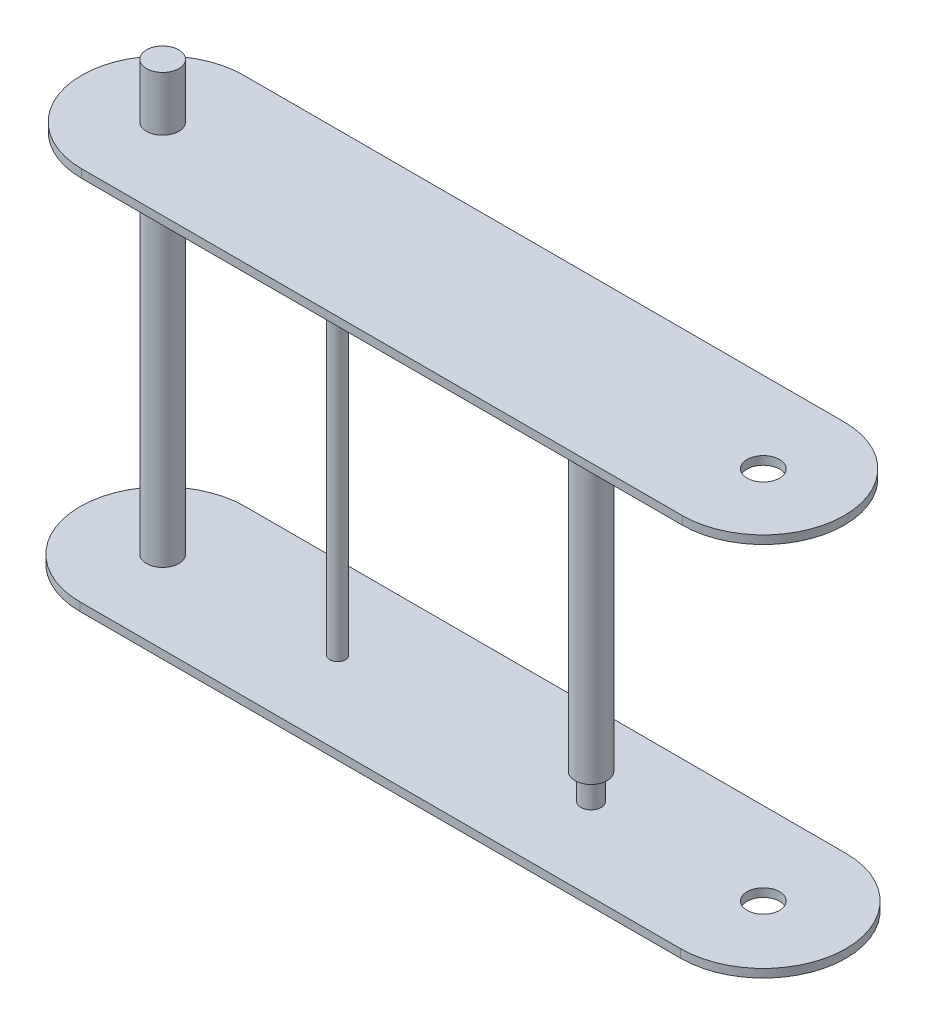
ISO-10303-21;
HEADER;
FILE_DESCRIPTION(('STEP AP214'),'2;1');
FILE_NAME('part.step','',(''),(''),'','','');
FILE_SCHEMA(('AUTOMOTIVE_DESIGN { 1 0 10303 214 1 1 1 1 }'));
ENDSEC;
DATA;
#1=APPLICATION_CONTEXT('core data for automotive mechanical design processes');
#2=APPLICATION_PROTOCOL_DEFINITION('international standard','automotive_design',2000,#1);
#3=PRODUCT_CONTEXT('',#1,'mechanical');
#4=PRODUCT('Part','Part','',(#3));
#5=PRODUCT_RELATED_PRODUCT_CATEGORY('part','',(#4));
#6=PRODUCT_DEFINITION_FORMATION('','',#4);
#7=PRODUCT_DEFINITION_CONTEXT('part definition',#1,'design');
#8=PRODUCT_DEFINITION('design','',#6,#7);
#9=PRODUCT_DEFINITION_SHAPE('','',#8);
#10=(LENGTH_UNIT() NAMED_UNIT(*) SI_UNIT(.MILLI.,.METRE.));
#11=(NAMED_UNIT(*) PLANE_ANGLE_UNIT() SI_UNIT($,.RADIAN.));
#12=(NAMED_UNIT(*) SI_UNIT($,.STERADIAN.) SOLID_ANGLE_UNIT());
#13=UNCERTAINTY_MEASURE_WITH_UNIT(LENGTH_MEASURE(1.E-05),#10,'distance_accuracy_value','');
#14=(GEOMETRIC_REPRESENTATION_CONTEXT(3) GLOBAL_UNCERTAINTY_ASSIGNED_CONTEXT((#13)) GLOBAL_UNIT_ASSIGNED_CONTEXT((#10,
#11,#12)) REPRESENTATION_CONTEXT('',''));
#15=CARTESIAN_POINT('',(0.,0.,0.));
#16=DIRECTION('',(0.,0.,1.));
#17=DIRECTION('',(1.,0.,0.));
#18=AXIS2_PLACEMENT_3D('',#15,#16,#17);
#19=CARTESIAN_POINT('',(-110.589063221043,3.2,0.));
#20=DIRECTION('',(0.,1.,0.));
#21=DIRECTION('',(0.,0.,1.));
#22=AXIS2_PLACEMENT_3D('',#19,#20,#21);
#23=PLANE('',#22);
#24=CARTESIAN_POINT('',(-110.589063221043,3.2,0.));
#25=DIRECTION('',(0.,1.,0.));
#26=DIRECTION('',(0.,0.,1.));
#27=AXIS2_PLACEMENT_3D('',#24,#25,#26);
#28=CIRCLE('',#27,6.19999999999999);
#29=CARTESIAN_POINT('',(-110.589063221043,3.2,6.19999999999999));
#30=VERTEX_POINT('',#29);
#31=EDGE_CURVE('E322',#30,#30,#28,.F.);
#32=ORIENTED_EDGE('',*,*,#31,.T.);
#33=EDGE_LOOP('',(#32));
#34=FACE_BOUND('',#33,.T.);
#35=CARTESIAN_POINT('',(53.3109367789571,3.2,0.));
#36=DIRECTION('',(0.,1.,0.));
#37=DIRECTION('',(0.,0.,1.));
#38=AXIS2_PLACEMENT_3D('',#35,#36,#37);
#39=CIRCLE('',#38,3.9);
#40=CARTESIAN_POINT('',(53.3109367789571,3.2,3.9));
#41=VERTEX_POINT('',#40);
#42=EDGE_CURVE('E338',#41,#41,#39,.T.);
#43=ORIENTED_EDGE('',*,*,#42,.F.);
#44=EDGE_LOOP('',(#43));
#45=FACE_BOUND('',#44,.T.);
#46=CARTESIAN_POINT('',(-43.6390632210429,3.2,0.));
#47=DIRECTION('',(0.,1.,0.));
#48=DIRECTION('',(0.,0.,1.));
#49=AXIS2_PLACEMENT_3D('',#46,#47,#48);
#50=CIRCLE('',#49,3.00000000000001);
#51=CARTESIAN_POINT('',(-43.6390632210429,3.2,3.00000000000002));
#52=VERTEX_POINT('',#51);
#53=EDGE_CURVE('E194',#52,#52,#50,.T.);
#54=ORIENTED_EDGE('',*,*,#53,.F.);
#55=EDGE_LOOP('',(#54));
#56=FACE_BOUND('',#55,.T.);
#57=CARTESIAN_POINT('',(-110.589063221043,3.2,0.));
#58=DIRECTION('',(0.,1.,0.));
#59=DIRECTION('',(0.,0.,1.));
#60=AXIS2_PLACEMENT_3D('',#57,#58,#59);
#61=CIRCLE('',#60,31.6);
#62=CARTESIAN_POINT('',(-110.589063221043,3.2,-31.6));
#63=VERTEX_POINT('',#62);
#64=CARTESIAN_POINT('',(-110.589063221043,3.2,31.6));
#65=VERTEX_POINT('',#64);
#66=EDGE_CURVE('E150',#63,#65,#61,.T.);
#67=ORIENTED_EDGE('',*,*,#66,.T.);
#68=DIRECTION('',(1.,0.,0.));
#69=VECTOR('',#68,1.);
#70=CARTESIAN_POINT('',(-110.589063221043,3.2,31.6));
#71=LINE('',#70,#69);
#72=CARTESIAN_POINT('',(119.210936778957,3.2,31.6));
#73=VERTEX_POINT('',#72);
#74=EDGE_CURVE('E85',#65,#73,#71,.T.);
#75=ORIENTED_EDGE('',*,*,#74,.T.);
#76=CARTESIAN_POINT('',(119.210936778957,3.2,0.));
#77=DIRECTION('',(0.,1.,0.));
#78=DIRECTION('',(0.,0.,1.));
#79=AXIS2_PLACEMENT_3D('',#76,#77,#78);
#80=CIRCLE('',#79,31.6);
#81=CARTESIAN_POINT('',(119.210936778957,3.2,-31.6));
#82=VERTEX_POINT('',#81);
#83=EDGE_CURVE('E153',#73,#82,#80,.T.);
#84=ORIENTED_EDGE('',*,*,#83,.T.);
#85=DIRECTION('',(-1.,0.,0.));
#86=VECTOR('',#85,1.);
#87=CARTESIAN_POINT('',(-110.589063221043,3.2,-31.6));
#88=LINE('',#87,#86);
#89=EDGE_CURVE('E53',#82,#63,#88,.T.);
#90=ORIENTED_EDGE('',*,*,#89,.T.);
#91=EDGE_LOOP('',(#67,#75,#84,#90));
#92=FACE_BOUND('',#91,.T.);
#93=CARTESIAN_POINT('',(119.210936778957,3.2,0.));
#94=DIRECTION('',(0.,1.,0.));
#95=DIRECTION('',(0.,0.,1.));
#96=AXIS2_PLACEMENT_3D('',#93,#94,#95);
#97=CIRCLE('',#96,6.19999999999999);
#98=CARTESIAN_POINT('',(119.210936778957,3.2,6.19999999999999));
#99=VERTEX_POINT('',#98);
#100=EDGE_CURVE('E141',#99,#99,#97,.T.);
#101=ORIENTED_EDGE('',*,*,#100,.F.);
#102=EDGE_LOOP('',(#101));
#103=FACE_BOUND('',#102,.T.);
#104=ADVANCED_FACE('F35',(#34,#45,#56,#92,#103),#23,.T.);
#105=CARTESIAN_POINT('',(-110.589063221043,0.,0.));
#106=DIRECTION('',(0.,1.,0.));
#107=DIRECTION('',(0.,0.,1.));
#108=AXIS2_PLACEMENT_3D('',#105,#106,#107);
#109=PLANE('',#108);
#110=CARTESIAN_POINT('',(-110.589063221043,0.,0.));
#111=DIRECTION('',(0.,1.,0.));
#112=DIRECTION('',(0.,0.,1.));
#113=AXIS2_PLACEMENT_3D('',#110,#111,#112);
#114=CIRCLE('',#113,6.19999999999999);
#115=CARTESIAN_POINT('',(-110.589063221043,0.,6.19999999999999));
#116=VERTEX_POINT('',#115);
#117=EDGE_CURVE('E11',#116,#116,#114,.F.);
#118=ORIENTED_EDGE('',*,*,#117,.F.);
#119=EDGE_LOOP('',(#118));
#120=FACE_BOUND('',#119,.T.);
#121=CARTESIAN_POINT('',(-110.589063221043,0.,0.));
#122=DIRECTION('',(0.,1.,0.));
#123=DIRECTION('',(0.,0.,1.));
#124=AXIS2_PLACEMENT_3D('',#121,#122,#123);
#125=CIRCLE('',#124,31.6);
#126=CARTESIAN_POINT('',(-110.589063221043,0.,-31.6));
#127=VERTEX_POINT('',#126);
#128=CARTESIAN_POINT('',(-110.589063221043,0.,31.6));
#129=VERTEX_POINT('',#128);
#130=EDGE_CURVE('E148',#127,#129,#125,.T.);
#131=ORIENTED_EDGE('',*,*,#130,.F.);
#132=DIRECTION('',(-1.,0.,0.));
#133=VECTOR('',#132,1.);
#134=CARTESIAN_POINT('',(-110.589063221043,0.,-31.6));
#135=LINE('',#134,#133);
#136=CARTESIAN_POINT('',(119.210936778957,0.,-31.6));
#137=VERTEX_POINT('',#136);
#138=EDGE_CURVE('E77',#137,#127,#135,.T.);
#139=ORIENTED_EDGE('',*,*,#138,.F.);
#140=CARTESIAN_POINT('',(119.210936778957,0.,0.));
#141=DIRECTION('',(0.,1.,0.));
#142=DIRECTION('',(0.,0.,1.));
#143=AXIS2_PLACEMENT_3D('',#140,#141,#142);
#144=CIRCLE('',#143,31.6);
#145=CARTESIAN_POINT('',(119.210936778957,0.,31.6));
#146=VERTEX_POINT('',#145);
#147=EDGE_CURVE('E71',#146,#137,#144,.T.);
#148=ORIENTED_EDGE('',*,*,#147,.F.);
#149=DIRECTION('',(1.,0.,0.));
#150=VECTOR('',#149,1.);
#151=CARTESIAN_POINT('',(-110.589063221043,0.,31.6));
#152=LINE('',#151,#150);
#153=EDGE_CURVE('E159',#129,#146,#152,.T.);
#154=ORIENTED_EDGE('',*,*,#153,.F.);
#155=EDGE_LOOP('',(#131,#139,#148,#154));
#156=FACE_BOUND('',#155,.T.);
#157=CARTESIAN_POINT('',(119.210936778957,0.,0.));
#158=DIRECTION('',(0.,1.,0.));
#159=DIRECTION('',(0.,0.,1.));
#160=AXIS2_PLACEMENT_3D('',#157,#158,#159);
#161=CIRCLE('',#160,6.19999999999999);
#162=CARTESIAN_POINT('',(119.210936778957,0.,6.19999999999999));
#163=VERTEX_POINT('',#162);
#164=EDGE_CURVE('E138',#163,#163,#161,.T.);
#165=ORIENTED_EDGE('',*,*,#164,.T.);
#166=EDGE_LOOP('',(#165));
#167=FACE_BOUND('',#166,.T.);
#168=ADVANCED_FACE('F228',(#120,#156,#167),#109,.F.);
#169=CARTESIAN_POINT('',(-110.589063221043,3.2,0.));
#170=DIRECTION('',(0.,-1.,0.));
#171=DIRECTION('',(0.,0.,-1.));
#172=AXIS2_PLACEMENT_3D('',#169,#170,#171);
#173=CYLINDRICAL_SURFACE('',#172,31.6);
#174=ORIENTED_EDGE('',*,*,#130,.T.);
#175=DIRECTION('',(0.,-1.,0.));
#176=VECTOR('',#175,1.);
#177=CARTESIAN_POINT('',(-110.589063221043,3.2,31.6));
#178=LINE('',#177,#176);
#179=EDGE_CURVE('E168',#65,#129,#178,.T.);
#180=ORIENTED_EDGE('',*,*,#179,.F.);
#181=ORIENTED_EDGE('',*,*,#66,.F.);
#182=DIRECTION('',(0.,-1.,0.));
#183=VECTOR('',#182,1.);
#184=CARTESIAN_POINT('',(-110.589063221043,3.2,-31.6));
#185=LINE('',#184,#183);
#186=EDGE_CURVE('E156',#63,#127,#185,.T.);
#187=ORIENTED_EDGE('',*,*,#186,.T.);
#188=EDGE_LOOP('',(#174,#180,#181,#187));
#189=FACE_BOUND('',#188,.T.);
#190=ADVANCED_FACE('F37',(#189),#173,.T.);
#191=CARTESIAN_POINT('',(-110.589063221043,3.2,31.6));
#192=DIRECTION('',(0.,0.,-1.));
#193=DIRECTION('',(-1.,0.,0.));
#194=AXIS2_PLACEMENT_3D('',#191,#192,#193);
#195=PLANE('',#194);
#196=ORIENTED_EDGE('',*,*,#153,.T.);
#197=DIRECTION('',(0.,-1.,0.));
#198=VECTOR('',#197,1.);
#199=CARTESIAN_POINT('',(119.210936778957,3.2,31.6));
#200=LINE('',#199,#198);
#201=EDGE_CURVE('E166',#73,#146,#200,.T.);
#202=ORIENTED_EDGE('',*,*,#201,.F.);
#203=ORIENTED_EDGE('',*,*,#74,.F.);
#204=ORIENTED_EDGE('',*,*,#179,.T.);
#205=EDGE_LOOP('',(#196,#202,#203,#204));
#206=FACE_BOUND('',#205,.T.);
#207=ADVANCED_FACE('F247',(#206),#195,.F.);
#208=CARTESIAN_POINT('',(119.210936778957,3.2,0.));
#209=DIRECTION('',(0.,-1.,0.));
#210=DIRECTION('',(0.,0.,-1.));
#211=AXIS2_PLACEMENT_3D('',#208,#209,#210);
#212=CYLINDRICAL_SURFACE('',#211,31.6);
#213=ORIENTED_EDGE('',*,*,#147,.T.);
#214=DIRECTION('',(0.,-1.,0.));
#215=VECTOR('',#214,1.);
#216=CARTESIAN_POINT('',(119.210936778957,3.2,-31.6));
#217=LINE('',#216,#215);
#218=EDGE_CURVE('E164',#82,#137,#217,.T.);
#219=ORIENTED_EDGE('',*,*,#218,.F.);
#220=ORIENTED_EDGE('',*,*,#83,.F.);
#221=ORIENTED_EDGE('',*,*,#201,.T.);
#222=EDGE_LOOP('',(#213,#219,#220,#221));
#223=FACE_BOUND('',#222,.T.);
#224=ADVANCED_FACE('F245',(#223),#212,.T.);
#225=CARTESIAN_POINT('',(-110.589063221043,3.2,-31.6));
#226=DIRECTION('',(0.,0.,1.));
#227=DIRECTION('',(1.,0.,0.));
#228=AXIS2_PLACEMENT_3D('',#225,#226,#227);
#229=PLANE('',#228);
#230=ORIENTED_EDGE('',*,*,#138,.T.);
#231=ORIENTED_EDGE('',*,*,#186,.F.);
#232=ORIENTED_EDGE('',*,*,#89,.F.);
#233=ORIENTED_EDGE('',*,*,#218,.T.);
#234=EDGE_LOOP('',(#230,#231,#232,#233));
#235=FACE_BOUND('',#234,.T.);
#236=ADVANCED_FACE('F242',(#235),#229,.F.);
#237=CARTESIAN_POINT('',(119.210936778957,3.2,0.));
#238=DIRECTION('',(0.,-1.,0.));
#239=DIRECTION('',(0.,0.,-1.));
#240=AXIS2_PLACEMENT_3D('',#237,#238,#239);
#241=CYLINDRICAL_SURFACE('',#240,6.19999999999999);
#242=ORIENTED_EDGE('',*,*,#100,.T.);
#243=EDGE_LOOP('',(#242));
#244=FACE_BOUND('',#243,.T.);
#245=ORIENTED_EDGE('',*,*,#164,.F.);
#246=EDGE_LOOP('',(#245));
#247=FACE_BOUND('',#246,.T.);
#248=ADVANCED_FACE('F239',(#244,#247),#241,.F.);
#249=CARTESIAN_POINT('',(-110.589063221043,146.4,0.));
#250=DIRECTION('',(0.,1.,0.));
#251=DIRECTION('',(0.,0.,1.));
#252=AXIS2_PLACEMENT_3D('',#249,#250,#251);
#253=PLANE('',#252);
#254=CARTESIAN_POINT('',(-110.589063221043,146.4,0.));
#255=DIRECTION('',(0.,1.,0.));
#256=DIRECTION('',(0.,0.,1.));
#257=AXIS2_PLACEMENT_3D('',#254,#255,#256);
#258=CIRCLE('',#257,6.19999999999999);
#259=CARTESIAN_POINT('',(-110.589063221043,146.4,6.19999999999999));
#260=VERTEX_POINT('',#259);
#261=EDGE_CURVE('E319',#260,#260,#258,.F.);
#262=ORIENTED_EDGE('',*,*,#261,.T.);
#263=EDGE_LOOP('',(#262));
#264=FACE_BOUND('',#263,.T.);
#265=CARTESIAN_POINT('',(-110.589063221043,146.4,0.));
#266=DIRECTION('',(0.,1.,0.));
#267=DIRECTION('',(0.,0.,1.));
#268=AXIS2_PLACEMENT_3D('',#265,#266,#267);
#269=CIRCLE('',#268,30.9881937080235);
#270=CARTESIAN_POINT('',(-110.589063221043,146.4,-30.9881937080235));
#271=VERTEX_POINT('',#270);
#272=CARTESIAN_POINT('',(-110.589063221043,146.4,30.9881937080235));
#273=VERTEX_POINT('',#272);
#274=EDGE_CURVE('E123',#271,#273,#269,.T.);
#275=ORIENTED_EDGE('',*,*,#274,.T.);
#276=DIRECTION('',(1.,0.,0.));
#277=VECTOR('',#276,1.);
#278=CARTESIAN_POINT('',(-110.589063221043,146.4,30.9881937080235));
#279=LINE('',#278,#277);
#280=CARTESIAN_POINT('',(119.210936778957,146.4,30.9881937080235));
#281=VERTEX_POINT('',#280);
#282=EDGE_CURVE('E112',#273,#281,#279,.T.);
#283=ORIENTED_EDGE('',*,*,#282,.T.);
#284=CARTESIAN_POINT('',(119.210936778957,146.4,0.));
#285=DIRECTION('',(0.,1.,0.));
#286=DIRECTION('',(0.,0.,1.));
#287=AXIS2_PLACEMENT_3D('',#284,#285,#286);
#288=CIRCLE('',#287,30.9881937080235);
#289=CARTESIAN_POINT('',(119.210936778957,146.4,-30.9881937080235));
#290=VERTEX_POINT('',#289);
#291=EDGE_CURVE('E122',#281,#290,#288,.T.);
#292=ORIENTED_EDGE('',*,*,#291,.T.);
#293=DIRECTION('',(-1.,0.,0.));
#294=VECTOR('',#293,1.);
#295=CARTESIAN_POINT('',(-110.589063221043,146.4,-30.9881937080235));
#296=LINE('',#295,#294);
#297=EDGE_CURVE('E129',#290,#271,#296,.T.);
#298=ORIENTED_EDGE('',*,*,#297,.T.);
#299=EDGE_LOOP('',(#275,#283,#292,#298));
#300=FACE_BOUND('',#299,.T.);
#301=CARTESIAN_POINT('',(119.210936778957,146.4,0.));
#302=DIRECTION('',(0.,1.,0.));
#303=DIRECTION('',(0.,0.,1.));
#304=AXIS2_PLACEMENT_3D('',#301,#302,#303);
#305=CIRCLE('',#304,6.19999999999999);
#306=CARTESIAN_POINT('',(119.210936778957,146.4,6.19999999999999));
#307=VERTEX_POINT('',#306);
#308=EDGE_CURVE('E193',#307,#307,#305,.T.);
#309=ORIENTED_EDGE('',*,*,#308,.F.);
#310=EDGE_LOOP('',(#309));
#311=FACE_BOUND('',#310,.T.);
#312=ADVANCED_FACE('F126',(#264,#300,#311),#253,.T.);
#313=CARTESIAN_POINT('',(-110.589063221043,143.2,0.));
#314=DIRECTION('',(0.,1.,0.));
#315=DIRECTION('',(0.,0.,1.));
#316=AXIS2_PLACEMENT_3D('',#313,#314,#315);
#317=PLANE('',#316);
#318=CARTESIAN_POINT('',(-110.589063221043,143.2,0.));
#319=DIRECTION('',(0.,1.,0.));
#320=DIRECTION('',(0.,0.,1.));
#321=AXIS2_PLACEMENT_3D('',#318,#319,#320);
#322=CIRCLE('',#321,6.19999999999999);
#323=CARTESIAN_POINT('',(-110.589063221043,143.2,6.19999999999999));
#324=VERTEX_POINT('',#323);
#325=EDGE_CURVE('E39',#324,#324,#322,.F.);
#326=ORIENTED_EDGE('',*,*,#325,.F.);
#327=EDGE_LOOP('',(#326));
#328=FACE_BOUND('',#327,.T.);
#329=CARTESIAN_POINT('',(53.3109367789571,143.2,0.));
#330=DIRECTION('',(0.,1.,0.));
#331=DIRECTION('',(0.,0.,1.));
#332=AXIS2_PLACEMENT_3D('',#329,#330,#331);
#333=CIRCLE('',#332,3.9);
#334=CARTESIAN_POINT('',(53.3109367789571,143.2,3.9));
#335=VERTEX_POINT('',#334);
#336=EDGE_CURVE('E185',#335,#335,#333,.T.);
#337=ORIENTED_EDGE('',*,*,#336,.T.);
#338=EDGE_LOOP('',(#337));
#339=FACE_BOUND('',#338,.T.);
#340=CARTESIAN_POINT('',(-43.6390632210429,143.2,0.));
#341=DIRECTION('',(0.,1.,0.));
#342=DIRECTION('',(0.,0.,1.));
#343=AXIS2_PLACEMENT_3D('',#340,#341,#342);
#344=CIRCLE('',#343,3.00000000000001);
#345=CARTESIAN_POINT('',(-43.6390632210429,143.2,3.00000000000002));
#346=VERTEX_POINT('',#345);
#347=EDGE_CURVE('E169',#346,#346,#344,.F.);
#348=ORIENTED_EDGE('',*,*,#347,.F.);
#349=EDGE_LOOP('',(#348));
#350=FACE_BOUND('',#349,.T.);
#351=CARTESIAN_POINT('',(-110.589063221043,143.2,0.));
#352=DIRECTION('',(0.,1.,0.));
#353=DIRECTION('',(0.,0.,1.));
#354=AXIS2_PLACEMENT_3D('',#351,#352,#353);
#355=CIRCLE('',#354,30.9881937080235);
#356=CARTESIAN_POINT('',(-110.589063221043,143.2,-30.9881937080235));
#357=VERTEX_POINT('',#356);
#358=CARTESIAN_POINT('',(-110.589063221043,143.2,30.9881937080235));
#359=VERTEX_POINT('',#358);
#360=EDGE_CURVE('E137',#357,#359,#355,.T.);
#361=ORIENTED_EDGE('',*,*,#360,.F.);
#362=DIRECTION('',(-1.,0.,0.));
#363=VECTOR('',#362,1.);
#364=CARTESIAN_POINT('',(-110.589063221043,143.2,-30.9881937080235));
#365=LINE('',#364,#363);
#366=CARTESIAN_POINT('',(119.210936778957,143.2,-30.9881937080235));
#367=VERTEX_POINT('',#366);
#368=EDGE_CURVE('E133',#367,#357,#365,.T.);
#369=ORIENTED_EDGE('',*,*,#368,.F.);
#370=CARTESIAN_POINT('',(119.210936778957,143.2,0.));
#371=DIRECTION('',(0.,1.,0.));
#372=DIRECTION('',(0.,0.,1.));
#373=AXIS2_PLACEMENT_3D('',#370,#371,#372);
#374=CIRCLE('',#373,30.9881937080235);
#375=CARTESIAN_POINT('',(119.210936778957,143.2,30.9881937080235));
#376=VERTEX_POINT('',#375);
#377=EDGE_CURVE('E208',#376,#367,#374,.T.);
#378=ORIENTED_EDGE('',*,*,#377,.F.);
#379=DIRECTION('',(1.,0.,0.));
#380=VECTOR('',#379,1.);
#381=CARTESIAN_POINT('',(-110.589063221043,143.2,30.9881937080235));
#382=LINE('',#381,#380);
#383=EDGE_CURVE('E206',#359,#376,#382,.T.);
#384=ORIENTED_EDGE('',*,*,#383,.F.);
#385=EDGE_LOOP('',(#361,#369,#378,#384));
#386=FACE_BOUND('',#385,.T.);
#387=CARTESIAN_POINT('',(119.210936778957,143.2,0.));
#388=DIRECTION('',(0.,1.,0.));
#389=DIRECTION('',(0.,0.,1.));
#390=AXIS2_PLACEMENT_3D('',#387,#388,#389);
#391=CIRCLE('',#390,6.19999999999999);
#392=CARTESIAN_POINT('',(119.210936778957,143.2,6.19999999999999));
#393=VERTEX_POINT('',#392);
#394=EDGE_CURVE('E191',#393,#393,#391,.T.);
#395=ORIENTED_EDGE('',*,*,#394,.T.);
#396=EDGE_LOOP('',(#395));
#397=FACE_BOUND('',#396,.T.);
#398=ADVANCED_FACE('F178',(#328,#339,#350,#386,#397),#317,.F.);
#399=CARTESIAN_POINT('',(-110.589063221043,146.4,0.));
#400=DIRECTION('',(0.,-1.,0.));
#401=DIRECTION('',(0.,0.,-1.));
#402=AXIS2_PLACEMENT_3D('',#399,#400,#401);
#403=CYLINDRICAL_SURFACE('',#402,30.9881937080235);
#404=ORIENTED_EDGE('',*,*,#360,.T.);
#405=DIRECTION('',(0.,-1.,0.));
#406=VECTOR('',#405,1.);
#407=CARTESIAN_POINT('',(-110.589063221043,146.4,30.9881937080235));
#408=LINE('',#407,#406);
#409=EDGE_CURVE('E116',#273,#359,#408,.T.);
#410=ORIENTED_EDGE('',*,*,#409,.F.);
#411=ORIENTED_EDGE('',*,*,#274,.F.);
#412=DIRECTION('',(0.,-1.,0.));
#413=VECTOR('',#412,1.);
#414=CARTESIAN_POINT('',(-110.589063221043,146.4,-30.9881937080235));
#415=LINE('',#414,#413);
#416=EDGE_CURVE('E204',#271,#357,#415,.T.);
#417=ORIENTED_EDGE('',*,*,#416,.T.);
#418=EDGE_LOOP('',(#404,#410,#411,#417));
#419=FACE_BOUND('',#418,.T.);
#420=ADVANCED_FACE('F135',(#419),#403,.T.);
#421=CARTESIAN_POINT('',(-110.589063221043,146.4,30.9881937080235));
#422=DIRECTION('',(0.,0.,-1.));
#423=DIRECTION('',(-1.,0.,0.));
#424=AXIS2_PLACEMENT_3D('',#421,#422,#423);
#425=PLANE('',#424);
#426=ORIENTED_EDGE('',*,*,#383,.T.);
#427=DIRECTION('',(0.,-1.,0.));
#428=VECTOR('',#427,1.);
#429=CARTESIAN_POINT('',(119.210936778957,146.4,30.9881937080235));
#430=LINE('',#429,#428);
#431=EDGE_CURVE('E119',#281,#376,#430,.T.);
#432=ORIENTED_EDGE('',*,*,#431,.F.);
#433=ORIENTED_EDGE('',*,*,#282,.F.);
#434=ORIENTED_EDGE('',*,*,#409,.T.);
#435=EDGE_LOOP('',(#426,#432,#433,#434));
#436=FACE_BOUND('',#435,.T.);
#437=ADVANCED_FACE('F114',(#436),#425,.F.);
#438=CARTESIAN_POINT('',(119.210936778957,146.4,0.));
#439=DIRECTION('',(0.,-1.,0.));
#440=DIRECTION('',(0.,0.,-1.));
#441=AXIS2_PLACEMENT_3D('',#438,#439,#440);
#442=CYLINDRICAL_SURFACE('',#441,30.9881937080235);
#443=ORIENTED_EDGE('',*,*,#377,.T.);
#444=DIRECTION('',(0.,-1.,0.));
#445=VECTOR('',#444,1.);
#446=CARTESIAN_POINT('',(119.210936778957,146.4,-30.9881937080235));
#447=LINE('',#446,#445);
#448=EDGE_CURVE('E143',#290,#367,#447,.T.);
#449=ORIENTED_EDGE('',*,*,#448,.F.);
#450=ORIENTED_EDGE('',*,*,#291,.F.);
#451=ORIENTED_EDGE('',*,*,#431,.T.);
#452=EDGE_LOOP('',(#443,#449,#450,#451));
#453=FACE_BOUND('',#452,.T.);
#454=ADVANCED_FACE('F217',(#453),#442,.T.);
#455=CARTESIAN_POINT('',(-110.589063221043,146.4,-30.9881937080235));
#456=DIRECTION('',(0.,0.,1.));
#457=DIRECTION('',(1.,0.,0.));
#458=AXIS2_PLACEMENT_3D('',#455,#456,#457);
#459=PLANE('',#458);
#460=ORIENTED_EDGE('',*,*,#368,.T.);
#461=ORIENTED_EDGE('',*,*,#416,.F.);
#462=ORIENTED_EDGE('',*,*,#297,.F.);
#463=ORIENTED_EDGE('',*,*,#448,.T.);
#464=EDGE_LOOP('',(#460,#461,#462,#463));
#465=FACE_BOUND('',#464,.T.);
#466=ADVANCED_FACE('F214',(#465),#459,.F.);
#467=CARTESIAN_POINT('',(119.210936778957,146.4,0.));
#468=DIRECTION('',(0.,-1.,0.));
#469=DIRECTION('',(0.,0.,-1.));
#470=AXIS2_PLACEMENT_3D('',#467,#468,#469);
#471=CYLINDRICAL_SURFACE('',#470,6.19999999999999);
#472=ORIENTED_EDGE('',*,*,#308,.T.);
#473=EDGE_LOOP('',(#472));
#474=FACE_BOUND('',#473,.T.);
#475=ORIENTED_EDGE('',*,*,#394,.F.);
#476=EDGE_LOOP('',(#475));
#477=FACE_BOUND('',#476,.T.);
#478=ADVANCED_FACE('F224',(#474,#477),#471,.F.);
#479=CARTESIAN_POINT('',(-43.6390632210429,143.2,0.));
#480=DIRECTION('',(0.,-1.,0.));
#481=DIRECTION('',(0.,0.,-1.));
#482=AXIS2_PLACEMENT_3D('',#479,#480,#481);
#483=CYLINDRICAL_SURFACE('',#482,3.00000000000001);
#484=ORIENTED_EDGE('',*,*,#347,.T.);
#485=EDGE_LOOP('',(#484));
#486=FACE_BOUND('',#485,.T.);
#487=ORIENTED_EDGE('',*,*,#53,.T.);
#488=EDGE_LOOP('',(#487));
#489=FACE_BOUND('',#488,.T.);
#490=ADVANCED_FACE('F276',(#486,#489),#483,.T.);
#491=CARTESIAN_POINT('',(53.3109367789571,13.2,0.));
#492=DIRECTION('',(0.,-1.,0.));
#493=DIRECTION('',(0.,0.,-1.));
#494=AXIS2_PLACEMENT_3D('',#491,#492,#493);
#495=CYLINDRICAL_SURFACE('',#494,3.9);
#496=CARTESIAN_POINT('',(53.3109367789571,13.2,0.));
#497=DIRECTION('',(0.,1.,0.));
#498=DIRECTION('',(0.,0.,1.));
#499=AXIS2_PLACEMENT_3D('',#496,#497,#498);
#500=CIRCLE('',#499,3.9);
#501=CARTESIAN_POINT('',(53.3109367789571,13.2,3.9));
#502=VERTEX_POINT('',#501);
#503=EDGE_CURVE('E199',#502,#502,#500,.T.);
#504=ORIENTED_EDGE('',*,*,#503,.F.);
#505=EDGE_LOOP('',(#504));
#506=FACE_BOUND('',#505,.T.);
#507=ORIENTED_EDGE('',*,*,#42,.T.);
#508=EDGE_LOOP('',(#507));
#509=FACE_BOUND('',#508,.T.);
#510=ADVANCED_FACE('F280',(#506,#509),#495,.T.);
#511=CARTESIAN_POINT('',(53.3109367789571,73.2,0.));
#512=DIRECTION('',(0.,-1.,0.));
#513=DIRECTION('',(0.,0.,-1.));
#514=AXIS2_PLACEMENT_3D('',#511,#512,#513);
#515=CYLINDRICAL_SURFACE('',#514,6.15);
#516=CARTESIAN_POINT('',(53.3109367789571,13.2,0.));
#517=DIRECTION('',(0.,1.,0.));
#518=DIRECTION('',(0.,0.,1.));
#519=AXIS2_PLACEMENT_3D('',#516,#517,#518);
#520=CIRCLE('',#519,6.15);
#521=CARTESIAN_POINT('',(53.3109367789571,13.2,6.15));
#522=VERTEX_POINT('',#521);
#523=EDGE_CURVE('E335',#522,#522,#520,.T.);
#524=ORIENTED_EDGE('',*,*,#523,.T.);
#525=EDGE_LOOP('',(#524));
#526=FACE_BOUND('',#525,.T.);
#527=CARTESIAN_POINT('',(53.3109367789571,133.2,0.));
#528=DIRECTION('',(0.,1.,0.));
#529=DIRECTION('',(0.,0.,1.));
#530=AXIS2_PLACEMENT_3D('',#527,#528,#529);
#531=CIRCLE('',#530,6.15);
#532=CARTESIAN_POINT('',(53.3109367789571,133.2,6.15));
#533=VERTEX_POINT('',#532);
#534=EDGE_CURVE('E328',#533,#533,#531,.T.);
#535=ORIENTED_EDGE('',*,*,#534,.F.);
#536=EDGE_LOOP('',(#535));
#537=FACE_BOUND('',#536,.T.);
#538=ADVANCED_FACE('F283',(#526,#537),#515,.T.);
#539=CARTESIAN_POINT('',(53.3109367789571,13.2,0.));
#540=DIRECTION('',(0.,1.,0.));
#541=DIRECTION('',(0.,0.,1.));
#542=AXIS2_PLACEMENT_3D('',#539,#540,#541);
#543=PLANE('',#542);
#544=ORIENTED_EDGE('',*,*,#503,.T.);
#545=EDGE_LOOP('',(#544));
#546=FACE_BOUND('',#545,.T.);
#547=ORIENTED_EDGE('',*,*,#523,.F.);
#548=EDGE_LOOP('',(#547));
#549=FACE_BOUND('',#548,.T.);
#550=ADVANCED_FACE('F287',(#546,#549),#543,.F.);
#551=CARTESIAN_POINT('',(53.3109367789571,133.2,0.));
#552=DIRECTION('',(0.,1.,0.));
#553=DIRECTION('',(0.,0.,1.));
#554=AXIS2_PLACEMENT_3D('',#551,#552,#553);
#555=CYLINDRICAL_SURFACE('',#554,3.9);
#556=CARTESIAN_POINT('',(53.3109367789571,133.2,0.));
#557=DIRECTION('',(0.,1.,0.));
#558=DIRECTION('',(0.,0.,1.));
#559=AXIS2_PLACEMENT_3D('',#556,#557,#558);
#560=CIRCLE('',#559,3.9);
#561=CARTESIAN_POINT('',(53.3109367789571,133.2,3.9));
#562=VERTEX_POINT('',#561);
#563=EDGE_CURVE('E331',#562,#562,#560,.T.);
#564=ORIENTED_EDGE('',*,*,#563,.T.);
#565=EDGE_LOOP('',(#564));
#566=FACE_BOUND('',#565,.T.);
#567=ORIENTED_EDGE('',*,*,#336,.F.);
#568=EDGE_LOOP('',(#567));
#569=FACE_BOUND('',#568,.T.);
#570=ADVANCED_FACE('F291',(#566,#569),#555,.T.);
#571=CARTESIAN_POINT('',(53.3109367789571,133.2,0.));
#572=DIRECTION('',(0.,-1.,0.));
#573=DIRECTION('',(0.,0.,1.));
#574=AXIS2_PLACEMENT_3D('',#571,#572,#573);
#575=PLANE('',#574);
#576=ORIENTED_EDGE('',*,*,#563,.F.);
#577=EDGE_LOOP('',(#576));
#578=FACE_BOUND('',#577,.T.);
#579=ORIENTED_EDGE('',*,*,#534,.T.);
#580=EDGE_LOOP('',(#579));
#581=FACE_BOUND('',#580,.T.);
#582=ADVANCED_FACE('F295',(#578,#581),#575,.F.);
#583=CARTESIAN_POINT('',(-110.589063221043,-20.8,0.));
#584=DIRECTION('',(0.,1.,0.));
#585=DIRECTION('',(0.,0.,1.));
#586=AXIS2_PLACEMENT_3D('',#583,#584,#585);
#587=CYLINDRICAL_SURFACE('',#586,6.19999999999999);
#588=ORIENTED_EDGE('',*,*,#31,.F.);
#589=EDGE_LOOP('',(#588));
#590=FACE_BOUND('',#589,.T.);
#591=ORIENTED_EDGE('',*,*,#325,.T.);
#592=EDGE_LOOP('',(#591));
#593=FACE_BOUND('',#592,.T.);
#594=ADVANCED_FACE('F176',(#590,#593),#587,.T.);
#595=CARTESIAN_POINT('',(-110.589063221043,167.2,0.));
#596=DIRECTION('',(0.,-1.,0.));
#597=DIRECTION('',(0.,0.,-1.));
#598=AXIS2_PLACEMENT_3D('',#595,#596,#597);
#599=PLANE('',#598);
#600=CARTESIAN_POINT('',(-110.589063221043,167.2,0.));
#601=DIRECTION('',(0.,-1.,0.));
#602=DIRECTION('',(0.,0.,-1.));
#603=AXIS2_PLACEMENT_3D('',#600,#601,#602);
#604=CIRCLE('',#603,6.19999999999999);
#605=CARTESIAN_POINT('',(-110.589063221043,167.2,-6.19999999999999));
#606=VERTEX_POINT('',#605);
#607=EDGE_CURVE('E320',#606,#606,#604,.T.);
#608=ORIENTED_EDGE('',*,*,#607,.F.);
#609=EDGE_LOOP('',(#608));
#610=FACE_BOUND('',#609,.T.);
#611=ADVANCED_FACE('F304',(#610),#599,.F.);
#612=ORIENTED_EDGE('',*,*,#261,.F.);
#613=EDGE_LOOP('',(#612));
#614=FACE_BOUND('',#613,.T.);
#615=ORIENTED_EDGE('',*,*,#607,.T.);
#616=EDGE_LOOP('',(#615));
#617=FACE_BOUND('',#616,.T.);
#618=ADVANCED_FACE('F300',(#614,#617),#587,.T.);
#619=CARTESIAN_POINT('',(-110.589063221043,-20.8,0.));
#620=DIRECTION('',(0.,-1.,0.));
#621=DIRECTION('',(0.,0.,-1.));
#622=AXIS2_PLACEMENT_3D('',#619,#620,#621);
#623=CIRCLE('',#622,6.19999999999999);
#624=CARTESIAN_POINT('',(-110.589063221043,-20.8,-6.19999999999999));
#625=VERTEX_POINT('',#624);
#626=EDGE_CURVE('E318',#625,#625,#623,.T.);
#627=ORIENTED_EDGE('',*,*,#626,.F.);
#628=EDGE_LOOP('',(#627));
#629=FACE_BOUND('',#628,.T.);
#630=ORIENTED_EDGE('',*,*,#117,.T.);
#631=EDGE_LOOP('',(#630));
#632=FACE_BOUND('',#631,.T.);
#633=ADVANCED_FACE('F303',(#629,#632),#587,.T.);
#634=CARTESIAN_POINT('',(-110.589063221043,-20.8,0.));
#635=DIRECTION('',(0.,-1.,0.));
#636=DIRECTION('',(0.,0.,-1.));
#637=AXIS2_PLACEMENT_3D('',#634,#635,#636);
#638=PLANE('',#637);
#639=ORIENTED_EDGE('',*,*,#626,.T.);
#640=EDGE_LOOP('',(#639));
#641=FACE_BOUND('',#640,.T.);
#642=ADVANCED_FACE('F309',(#641),#638,.T.);
#643=CLOSED_SHELL('',(#104,#168,#190,#207,#224,#236,#248,#312,#398,#420,#437,#454,#466,#478,
#490,#510,#538,#550,#570,#582,#594,#611,#618,#633,#642));
#644=MANIFOLD_SOLID_BREP('B2',#643);
#645=ADVANCED_BREP_SHAPE_REPRESENTATION('',(#18,#644),#14);
#646=SHAPE_DEFINITION_REPRESENTATION(#9,#645);
ENDSEC;
END-ISO-10303-21;
